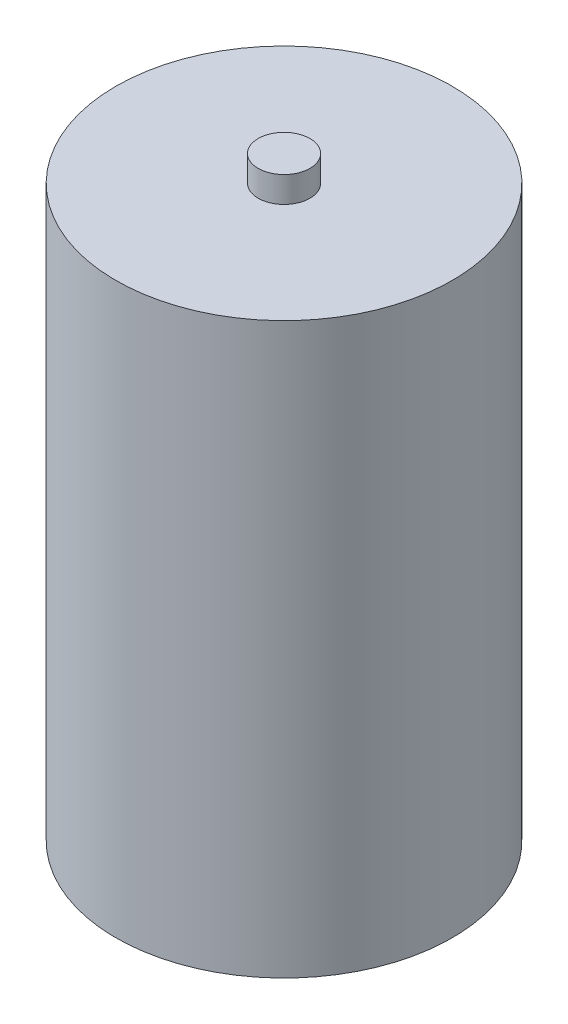
ISO-10303-21;
HEADER;
FILE_DESCRIPTION(('STEP AP214'),'2;1');
FILE_NAME('part.step','',(''),(''),'','','');
FILE_SCHEMA(('AUTOMOTIVE_DESIGN { 1 0 10303 214 1 1 1 1 }'));
ENDSEC;
DATA;
#1=APPLICATION_CONTEXT('core data for automotive mechanical design processes');
#2=APPLICATION_PROTOCOL_DEFINITION('international standard','automotive_design',2000,#1);
#3=PRODUCT_CONTEXT('',#1,'mechanical');
#4=PRODUCT('Part','Part','',(#3));
#5=PRODUCT_RELATED_PRODUCT_CATEGORY('part','',(#4));
#6=PRODUCT_DEFINITION_FORMATION('','',#4);
#7=PRODUCT_DEFINITION_CONTEXT('part definition',#1,'design');
#8=PRODUCT_DEFINITION('design','',#6,#7);
#9=PRODUCT_DEFINITION_SHAPE('','',#8);
#10=(LENGTH_UNIT() NAMED_UNIT(*) SI_UNIT(.MILLI.,.METRE.));
#11=(NAMED_UNIT(*) PLANE_ANGLE_UNIT() SI_UNIT($,.RADIAN.));
#12=(NAMED_UNIT(*) SI_UNIT($,.STERADIAN.) SOLID_ANGLE_UNIT());
#13=UNCERTAINTY_MEASURE_WITH_UNIT(LENGTH_MEASURE(1.E-05),#10,'distance_accuracy_value','');
#14=(GEOMETRIC_REPRESENTATION_CONTEXT(3) GLOBAL_UNCERTAINTY_ASSIGNED_CONTEXT((#13)) GLOBAL_UNIT_ASSIGNED_CONTEXT((#10,
#11,#12)) REPRESENTATION_CONTEXT('',''));
#15=CARTESIAN_POINT('',(0.,0.,0.));
#16=DIRECTION('',(0.,0.,1.));
#17=DIRECTION('',(1.,0.,0.));
#18=AXIS2_PLACEMENT_3D('',#15,#16,#17);
#19=CARTESIAN_POINT('',(0.,120.,0.));
#20=DIRECTION('',(0.,-1.,0.));
#21=DIRECTION('',(1.,0.,0.));
#22=AXIS2_PLACEMENT_3D('',#19,#20,#21);
#23=PLANE('',#22);
#24=CARTESIAN_POINT('',(0.,120.,0.));
#25=DIRECTION('',(0.,1.,0.));
#26=DIRECTION('',(-1.,0.,0.));
#27=AXIS2_PLACEMENT_3D('',#24,#25,#26);
#28=CIRCLE('',#27,5.);
#29=CARTESIAN_POINT('',(-5.00000000000001,120.,0.));
#30=VERTEX_POINT('',#29);
#31=EDGE_CURVE('E10',#30,#30,#28,.T.);
#32=ORIENTED_EDGE('',*,*,#31,.T.);
#33=EDGE_LOOP('',(#32));
#34=FACE_BOUND('',#33,.T.);
#35=ADVANCED_FACE('F41',(#34),#23,.F.);
#36=CARTESIAN_POINT('',(0.,120.,0.));
#37=DIRECTION('',(0.,1.,0.));
#38=DIRECTION('',(-1.,0.,0.));
#39=AXIS2_PLACEMENT_3D('',#36,#37,#38);
#40=CYLINDRICAL_SURFACE('',#39,5.);
#41=ORIENTED_EDGE('',*,*,#31,.F.);
#42=EDGE_LOOP('',(#41));
#43=FACE_BOUND('',#42,.T.);
#44=CARTESIAN_POINT('',(0.,115.,0.));
#45=DIRECTION('',(0.,1.,0.));
#46=DIRECTION('',(-1.,0.,0.));
#47=AXIS2_PLACEMENT_3D('',#44,#45,#46);
#48=CIRCLE('',#47,5.);
#49=CARTESIAN_POINT('',(-5.00000000000001,115.,0.));
#50=VERTEX_POINT('',#49);
#51=EDGE_CURVE('E48',#50,#50,#48,.T.);
#52=ORIENTED_EDGE('',*,*,#51,.T.);
#53=EDGE_LOOP('',(#52));
#54=FACE_BOUND('',#53,.T.);
#55=ADVANCED_FACE('F85',(#43,#54),#40,.T.);
#56=CARTESIAN_POINT('',(4.99999999999999,115.,0.));
#57=DIRECTION('',(0.,-1.,0.));
#58=DIRECTION('',(1.,0.,0.));
#59=AXIS2_PLACEMENT_3D('',#56,#57,#58);
#60=PLANE('',#59);
#61=ORIENTED_EDGE('',*,*,#51,.F.);
#62=EDGE_LOOP('',(#61));
#63=FACE_BOUND('',#62,.T.);
#64=CARTESIAN_POINT('',(0.,115.,0.));
#65=DIRECTION('',(0.,1.,0.));
#66=DIRECTION('',(-1.,0.,0.));
#67=AXIS2_PLACEMENT_3D('',#64,#65,#66);
#68=CIRCLE('',#67,32.5);
#69=CARTESIAN_POINT('',(-32.5,115.,0.));
#70=VERTEX_POINT('',#69);
#71=EDGE_CURVE('E53',#70,#70,#68,.T.);
#72=ORIENTED_EDGE('',*,*,#71,.T.);
#73=EDGE_LOOP('',(#72));
#74=FACE_BOUND('',#73,.T.);
#75=ADVANCED_FACE('F89',(#63,#74),#60,.F.);
#76=CARTESIAN_POINT('',(0.,120.,0.));
#77=DIRECTION('',(0.,1.,0.));
#78=DIRECTION('',(-1.,0.,0.));
#79=AXIS2_PLACEMENT_3D('',#76,#77,#78);
#80=CYLINDRICAL_SURFACE('',#79,32.5);
#81=ORIENTED_EDGE('',*,*,#71,.F.);
#82=EDGE_LOOP('',(#81));
#83=FACE_BOUND('',#82,.T.);
#84=CARTESIAN_POINT('',(0.,5.,0.));
#85=DIRECTION('',(0.,1.,0.));
#86=DIRECTION('',(-1.,0.,0.));
#87=AXIS2_PLACEMENT_3D('',#84,#85,#86);
#88=CIRCLE('',#87,32.5);
#89=CARTESIAN_POINT('',(-32.5,5.,0.));
#90=VERTEX_POINT('',#89);
#91=EDGE_CURVE('E58',#90,#90,#88,.T.);
#92=ORIENTED_EDGE('',*,*,#91,.T.);
#93=EDGE_LOOP('',(#92));
#94=FACE_BOUND('',#93,.T.);
#95=ADVANCED_FACE('F94',(#83,#94),#80,.T.);
#96=CARTESIAN_POINT('',(32.5,5.,0.));
#97=DIRECTION('',(0.,1.,0.));
#98=DIRECTION('',(-1.,0.,0.));
#99=AXIS2_PLACEMENT_3D('',#96,#97,#98);
#100=PLANE('',#99);
#101=ORIENTED_EDGE('',*,*,#91,.F.);
#102=EDGE_LOOP('',(#101));
#103=FACE_BOUND('',#102,.T.);
#104=CARTESIAN_POINT('',(0.,4.99999999999999,0.));
#105=DIRECTION('',(0.,1.,0.));
#106=DIRECTION('',(-1.,0.,0.));
#107=AXIS2_PLACEMENT_3D('',#104,#105,#106);
#108=CIRCLE('',#107,5.00000000000001);
#109=CARTESIAN_POINT('',(-5.00000000000001,4.99999999999999,0.));
#110=VERTEX_POINT('',#109);
#111=EDGE_CURVE('E64',#110,#110,#108,.T.);
#112=ORIENTED_EDGE('',*,*,#111,.T.);
#113=EDGE_LOOP('',(#112));
#114=FACE_BOUND('',#113,.T.);
#115=ADVANCED_FACE('F81',(#103,#114),#100,.F.);
#116=CARTESIAN_POINT('',(0.,120.,0.));
#117=DIRECTION('',(0.,1.,0.));
#118=DIRECTION('',(-1.,0.,0.));
#119=AXIS2_PLACEMENT_3D('',#116,#117,#118);
#120=CYLINDRICAL_SURFACE('',#119,5.);
#121=ORIENTED_EDGE('',*,*,#111,.F.);
#122=EDGE_LOOP('',(#121));
#123=FACE_BOUND('',#122,.T.);
#124=CARTESIAN_POINT('',(0.,0.,0.));
#125=DIRECTION('',(0.,1.,0.));
#126=DIRECTION('',(-1.,0.,0.));
#127=AXIS2_PLACEMENT_3D('',#124,#125,#126);
#128=CIRCLE('',#127,5.);
#129=CARTESIAN_POINT('',(-5.,0.,0.));
#130=VERTEX_POINT('',#129);
#131=EDGE_CURVE('E68',#130,#130,#128,.T.);
#132=ORIENTED_EDGE('',*,*,#131,.T.);
#133=EDGE_LOOP('',(#132));
#134=FACE_BOUND('',#133,.T.);
#135=ADVANCED_FACE('F73',(#123,#134),#120,.T.);
#136=CARTESIAN_POINT('',(5.,0.,0.));
#137=DIRECTION('',(0.,1.,0.));
#138=DIRECTION('',(-1.,0.,0.));
#139=AXIS2_PLACEMENT_3D('',#136,#137,#138);
#140=PLANE('',#139);
#141=ORIENTED_EDGE('',*,*,#131,.F.);
#142=EDGE_LOOP('',(#141));
#143=FACE_BOUND('',#142,.T.);
#144=ADVANCED_FACE('F75',(#143),#140,.F.);
#145=CLOSED_SHELL('',(#35,#55,#75,#95,#115,#135,#144));
#146=MANIFOLD_SOLID_BREP('B2',#145);
#147=ADVANCED_BREP_SHAPE_REPRESENTATION('',(#18,#146),#14);
#148=SHAPE_DEFINITION_REPRESENTATION(#9,#147);
ENDSEC;
END-ISO-10303-21;
